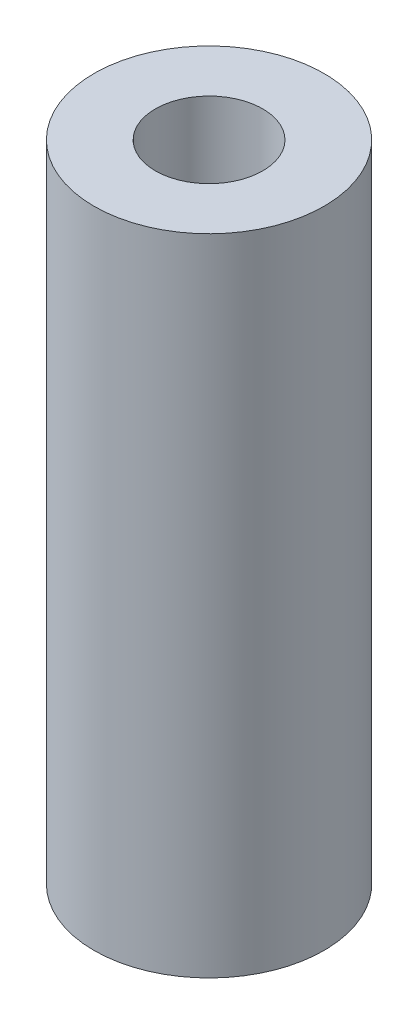
ISO-10303-21;
HEADER;
FILE_DESCRIPTION(('STEP AP214'),'2;1');
FILE_NAME('part.step','',(''),(''),'','','');
FILE_SCHEMA(('AUTOMOTIVE_DESIGN { 1 0 10303 214 1 1 1 1 }'));
ENDSEC;
DATA;
#1=APPLICATION_CONTEXT('core data for automotive mechanical design processes');
#2=APPLICATION_PROTOCOL_DEFINITION('international standard','automotive_design',2000,#1);
#3=PRODUCT_CONTEXT('',#1,'mechanical');
#4=PRODUCT('Part','Part','',(#3));
#5=PRODUCT_RELATED_PRODUCT_CATEGORY('part','',(#4));
#6=PRODUCT_DEFINITION_FORMATION('','',#4);
#7=PRODUCT_DEFINITION_CONTEXT('part definition',#1,'design');
#8=PRODUCT_DEFINITION('design','',#6,#7);
#9=PRODUCT_DEFINITION_SHAPE('','',#8);
#10=(LENGTH_UNIT() NAMED_UNIT(*) SI_UNIT(.MILLI.,.METRE.));
#11=(NAMED_UNIT(*) PLANE_ANGLE_UNIT() SI_UNIT($,.RADIAN.));
#12=(NAMED_UNIT(*) SI_UNIT($,.STERADIAN.) SOLID_ANGLE_UNIT());
#13=UNCERTAINTY_MEASURE_WITH_UNIT(LENGTH_MEASURE(1.E-05),#10,'distance_accuracy_value','');
#14=(GEOMETRIC_REPRESENTATION_CONTEXT(3) GLOBAL_UNCERTAINTY_ASSIGNED_CONTEXT((#13)) GLOBAL_UNIT_ASSIGNED_CONTEXT((#10,
#11,#12)) REPRESENTATION_CONTEXT('',''));
#15=CARTESIAN_POINT('',(0.,0.,0.));
#16=DIRECTION('',(0.,0.,1.));
#17=DIRECTION('',(1.,0.,0.));
#18=AXIS2_PLACEMENT_3D('',#15,#16,#17);
#19=CARTESIAN_POINT('',(0.,18.288,0.));
#20=DIRECTION('',(0.,1.,0.));
#21=DIRECTION('',(0.,0.,1.));
#22=AXIS2_PLACEMENT_3D('',#19,#20,#21);
#23=PLANE('',#22);
#24=CARTESIAN_POINT('',(0.,18.288,0.));
#25=DIRECTION('',(0.,1.,0.));
#26=DIRECTION('',(0.,0.,1.));
#27=AXIS2_PLACEMENT_3D('',#24,#25,#26);
#28=CIRCLE('',#27,3.2639);
#29=CARTESIAN_POINT('',(0.,18.288,3.2639));
#30=VERTEX_POINT('',#29);
#31=EDGE_CURVE('E10',#30,#30,#28,.T.);
#32=ORIENTED_EDGE('',*,*,#31,.T.);
#33=EDGE_LOOP('',(#32));
#34=FACE_BOUND('',#33,.T.);
#35=CARTESIAN_POINT('',(0.,18.288,0.));
#36=DIRECTION('',(0.,1.,0.));
#37=DIRECTION('',(0.,0.,1.));
#38=AXIS2_PLACEMENT_3D('',#35,#36,#37);
#39=CIRCLE('',#38,1.524);
#40=CARTESIAN_POINT('',(0.,18.288,1.524));
#41=VERTEX_POINT('',#40);
#42=EDGE_CURVE('E44',#41,#41,#39,.T.);
#43=ORIENTED_EDGE('',*,*,#42,.F.);
#44=EDGE_LOOP('',(#43));
#45=FACE_BOUND('',#44,.T.);
#46=ADVANCED_FACE('F33',(#34,#45),#23,.T.);
#47=CARTESIAN_POINT('',(0.,0.,0.));
#48=DIRECTION('',(0.,1.,0.));
#49=DIRECTION('',(0.,0.,1.));
#50=AXIS2_PLACEMENT_3D('',#47,#48,#49);
#51=PLANE('',#50);
#52=CARTESIAN_POINT('',(0.,0.,0.));
#53=DIRECTION('',(0.,1.,0.));
#54=DIRECTION('',(0.,0.,1.));
#55=AXIS2_PLACEMENT_3D('',#52,#53,#54);
#56=CIRCLE('',#55,3.2639);
#57=CARTESIAN_POINT('',(0.,0.,3.2639));
#58=VERTEX_POINT('',#57);
#59=EDGE_CURVE('E37',#58,#58,#56,.T.);
#60=ORIENTED_EDGE('',*,*,#59,.F.);
#61=EDGE_LOOP('',(#60));
#62=FACE_BOUND('',#61,.T.);
#63=CARTESIAN_POINT('',(0.,0.,0.));
#64=DIRECTION('',(0.,1.,0.));
#65=DIRECTION('',(0.,0.,1.));
#66=AXIS2_PLACEMENT_3D('',#63,#64,#65);
#67=CIRCLE('',#66,1.524);
#68=CARTESIAN_POINT('',(0.,0.,1.524));
#69=VERTEX_POINT('',#68);
#70=EDGE_CURVE('E46',#69,#69,#67,.T.);
#71=ORIENTED_EDGE('',*,*,#70,.T.);
#72=EDGE_LOOP('',(#71));
#73=FACE_BOUND('',#72,.T.);
#74=ADVANCED_FACE('F56',(#62,#73),#51,.F.);
#75=CARTESIAN_POINT('',(0.,18.288,0.));
#76=DIRECTION('',(0.,-1.,0.));
#77=DIRECTION('',(0.,0.,-1.));
#78=AXIS2_PLACEMENT_3D('',#75,#76,#77);
#79=CYLINDRICAL_SURFACE('',#78,3.2639);
#80=ORIENTED_EDGE('',*,*,#31,.F.);
#81=EDGE_LOOP('',(#80));
#82=FACE_BOUND('',#81,.T.);
#83=ORIENTED_EDGE('',*,*,#59,.T.);
#84=EDGE_LOOP('',(#83));
#85=FACE_BOUND('',#84,.T.);
#86=ADVANCED_FACE('F35',(#82,#85),#79,.T.);
#87=CARTESIAN_POINT('',(0.,18.288,0.));
#88=DIRECTION('',(0.,-1.,0.));
#89=DIRECTION('',(0.,0.,-1.));
#90=AXIS2_PLACEMENT_3D('',#87,#88,#89);
#91=CYLINDRICAL_SURFACE('',#90,1.524);
#92=ORIENTED_EDGE('',*,*,#42,.T.);
#93=EDGE_LOOP('',(#92));
#94=FACE_BOUND('',#93,.T.);
#95=ORIENTED_EDGE('',*,*,#70,.F.);
#96=EDGE_LOOP('',(#95));
#97=FACE_BOUND('',#96,.T.);
#98=ADVANCED_FACE('F52',(#94,#97),#91,.F.);
#99=CLOSED_SHELL('',(#46,#74,#86,#98));
#100=MANIFOLD_SOLID_BREP('B2',#99);
#101=ADVANCED_BREP_SHAPE_REPRESENTATION('',(#18,#100),#14);
#102=SHAPE_DEFINITION_REPRESENTATION(#9,#101);
ENDSEC;
END-ISO-10303-21;
